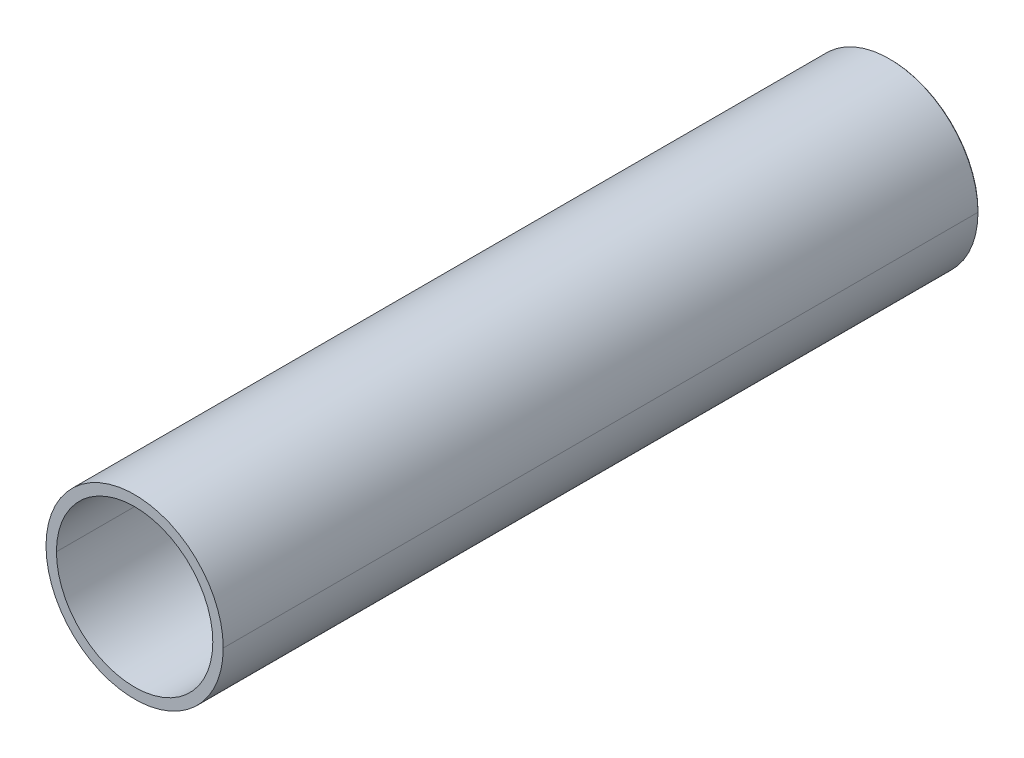
ISO-10303-21;
HEADER;
FILE_DESCRIPTION(('STEP AP214'),'2;1');
FILE_NAME('part.step','',(''),(''),'','','');
FILE_SCHEMA(('AUTOMOTIVE_DESIGN { 1 0 10303 214 1 1 1 1 }'));
ENDSEC;
DATA;
#1=APPLICATION_CONTEXT('core data for automotive mechanical design processes');
#2=APPLICATION_PROTOCOL_DEFINITION('international standard','automotive_design',2000,#1);
#3=PRODUCT_CONTEXT('',#1,'mechanical');
#4=PRODUCT('Part','Part','',(#3));
#5=PRODUCT_RELATED_PRODUCT_CATEGORY('part','',(#4));
#6=PRODUCT_DEFINITION_FORMATION('','',#4);
#7=PRODUCT_DEFINITION_CONTEXT('part definition',#1,'design');
#8=PRODUCT_DEFINITION('design','',#6,#7);
#9=PRODUCT_DEFINITION_SHAPE('','',#8);
#10=(LENGTH_UNIT() NAMED_UNIT(*) SI_UNIT(.MILLI.,.METRE.));
#11=(NAMED_UNIT(*) PLANE_ANGLE_UNIT() SI_UNIT($,.RADIAN.));
#12=(NAMED_UNIT(*) SI_UNIT($,.STERADIAN.) SOLID_ANGLE_UNIT());
#13=UNCERTAINTY_MEASURE_WITH_UNIT(LENGTH_MEASURE(1.E-05),#10,'distance_accuracy_value','');
#14=(GEOMETRIC_REPRESENTATION_CONTEXT(3) GLOBAL_UNCERTAINTY_ASSIGNED_CONTEXT((#13)) GLOBAL_UNIT_ASSIGNED_CONTEXT((#10,
#11,#12)) REPRESENTATION_CONTEXT('',''));
#15=CARTESIAN_POINT('',(0.,0.,0.));
#16=DIRECTION('',(0.,0.,1.));
#17=DIRECTION('',(1.,0.,0.));
#18=AXIS2_PLACEMENT_3D('',#15,#16,#17);
#19=CARTESIAN_POINT('',(0.,0.,-287.));
#20=DIRECTION('',(0.,0.,1.));
#21=DIRECTION('',(1.,0.,0.));
#22=AXIS2_PLACEMENT_3D('',#19,#20,#21);
#23=CYLINDRICAL_SURFACE('',#22,15.);
#24=CARTESIAN_POINT('',(0.,0.,-240.));
#25=DIRECTION('',(0.,0.,1.));
#26=DIRECTION('',(1.,0.,0.));
#27=AXIS2_PLACEMENT_3D('',#24,#25,#26);
#28=CIRCLE('',#27,15.);
#29=CARTESIAN_POINT('',(-15.,0.,-240.));
#30=VERTEX_POINT('',#29);
#31=CARTESIAN_POINT('',(15.,0.,-240.));
#32=VERTEX_POINT('',#31);
#33=EDGE_CURVE('E66',#30,#32,#28,.F.);
#34=ORIENTED_EDGE('',*,*,#33,.F.);
#35=DIRECTION('',(0.,0.,1.));
#36=VECTOR('',#35,1.);
#37=CARTESIAN_POINT('',(-15.,0.,-287.));
#38=LINE('',#37,#36);
#39=CARTESIAN_POINT('',(-15.,0.,-287.));
#40=VERTEX_POINT('',#39);
#41=EDGE_CURVE('E191',#40,#30,#38,.T.);
#42=ORIENTED_EDGE('',*,*,#41,.F.);
#43=CARTESIAN_POINT('',(0.,0.,-287.));
#44=DIRECTION('',(0.,0.,1.));
#45=DIRECTION('',(1.,0.,0.));
#46=AXIS2_PLACEMENT_3D('',#43,#44,#45);
#47=CIRCLE('',#46,15.);
#48=CARTESIAN_POINT('',(15.,0.,-287.));
#49=VERTEX_POINT('',#48);
#50=EDGE_CURVE('E184',#49,#40,#47,.T.);
#51=ORIENTED_EDGE('',*,*,#50,.F.);
#52=DIRECTION('',(0.,0.,1.));
#53=VECTOR('',#52,1.);
#54=CARTESIAN_POINT('',(15.,0.,-287.));
#55=LINE('',#54,#53);
#56=EDGE_CURVE('E172',#49,#32,#55,.T.);
#57=ORIENTED_EDGE('',*,*,#56,.T.);
#58=EDGE_LOOP('',(#34,#42,#51,#57));
#59=FACE_BOUND('',#58,.T.);
#60=ADVANCED_FACE('F51',(#59),#23,.F.);
#61=CARTESIAN_POINT('',(0.,0.,-385.));
#62=DIRECTION('',(0.,0.,1.));
#63=DIRECTION('',(1.,0.,0.));
#64=AXIS2_PLACEMENT_3D('',#61,#62,#63);
#65=CYLINDRICAL_SURFACE('',#64,17.);
#66=DIRECTION('',(0.,0.,1.));
#67=VECTOR('',#66,1.);
#68=CARTESIAN_POINT('',(17.,0.,-385.));
#69=LINE('',#68,#67);
#70=CARTESIAN_POINT('',(17.,0.,-384.8));
#71=VERTEX_POINT('',#70);
#72=CARTESIAN_POINT('',(17.,0.,-240.));
#73=VERTEX_POINT('',#72);
#74=EDGE_CURVE('E135',#71,#73,#69,.T.);
#75=ORIENTED_EDGE('',*,*,#74,.T.);
#76=CARTESIAN_POINT('',(0.,0.,-240.));
#77=DIRECTION('',(0.,0.,1.));
#78=DIRECTION('',(1.,0.,0.));
#79=AXIS2_PLACEMENT_3D('',#76,#77,#78);
#80=CIRCLE('',#79,17.);
#81=CARTESIAN_POINT('',(-17.,0.,-240.));
#82=VERTEX_POINT('',#81);
#83=EDGE_CURVE('E73',#73,#82,#80,.F.);
#84=ORIENTED_EDGE('',*,*,#83,.T.);
#85=DIRECTION('',(0.,0.,1.));
#86=VECTOR('',#85,1.);
#87=CARTESIAN_POINT('',(-17.,0.,-385.));
#88=LINE('',#87,#86);
#89=CARTESIAN_POINT('',(-17.,0.,-384.8));
#90=VERTEX_POINT('',#89);
#91=EDGE_CURVE('E133',#90,#82,#88,.T.);
#92=ORIENTED_EDGE('',*,*,#91,.F.);
#93=CARTESIAN_POINT('',(0.,0.,-384.8));
#94=DIRECTION('',(0.,0.,1.));
#95=DIRECTION('',(1.,0.,0.));
#96=AXIS2_PLACEMENT_3D('',#93,#94,#95);
#97=CIRCLE('',#96,17.);
#98=EDGE_CURVE('E164',#90,#71,#97,.T.);
#99=ORIENTED_EDGE('',*,*,#98,.T.);
#100=EDGE_LOOP('',(#75,#84,#92,#99));
#101=FACE_BOUND('',#100,.T.);
#102=ADVANCED_FACE('F132',(#101),#65,.T.);
#103=CARTESIAN_POINT('',(0.,0.,-287.));
#104=DIRECTION('',(0.,0.,1.));
#105=DIRECTION('',(1.,0.,0.));
#106=AXIS2_PLACEMENT_3D('',#103,#104,#105);
#107=CYLINDRICAL_SURFACE('',#106,15.);
#108=CARTESIAN_POINT('',(0.,0.,-240.));
#109=DIRECTION('',(0.,0.,1.));
#110=DIRECTION('',(1.,0.,0.));
#111=AXIS2_PLACEMENT_3D('',#108,#109,#110);
#112=CIRCLE('',#111,15.);
#113=EDGE_CURVE('E137',#32,#30,#112,.F.);
#114=ORIENTED_EDGE('',*,*,#113,.F.);
#115=ORIENTED_EDGE('',*,*,#56,.F.);
#116=CARTESIAN_POINT('',(0.,0.,-287.));
#117=DIRECTION('',(0.,0.,1.));
#118=DIRECTION('',(1.,0.,0.));
#119=AXIS2_PLACEMENT_3D('',#116,#117,#118);
#120=CIRCLE('',#119,15.);
#121=EDGE_CURVE('E202',#40,#49,#120,.T.);
#122=ORIENTED_EDGE('',*,*,#121,.F.);
#123=ORIENTED_EDGE('',*,*,#41,.T.);
#124=EDGE_LOOP('',(#114,#115,#122,#123));
#125=FACE_BOUND('',#124,.T.);
#126=ADVANCED_FACE('F226',(#125),#107,.F.);
#127=CARTESIAN_POINT('',(0.,0.,-385.));
#128=DIRECTION('',(0.,0.,1.));
#129=DIRECTION('',(1.,0.,0.));
#130=AXIS2_PLACEMENT_3D('',#127,#128,#129);
#131=CYLINDRICAL_SURFACE('',#130,17.);
#132=ORIENTED_EDGE('',*,*,#91,.T.);
#133=CARTESIAN_POINT('',(0.,0.,-240.));
#134=DIRECTION('',(0.,0.,1.));
#135=DIRECTION('',(1.,0.,0.));
#136=AXIS2_PLACEMENT_3D('',#133,#134,#135);
#137=CIRCLE('',#136,17.);
#138=EDGE_CURVE('E11',#82,#73,#137,.F.);
#139=ORIENTED_EDGE('',*,*,#138,.T.);
#140=ORIENTED_EDGE('',*,*,#74,.F.);
#141=CARTESIAN_POINT('',(0.,0.,-384.8));
#142=DIRECTION('',(0.,0.,1.));
#143=DIRECTION('',(1.,0.,0.));
#144=AXIS2_PLACEMENT_3D('',#141,#142,#143);
#145=CIRCLE('',#144,17.);
#146=EDGE_CURVE('E141',#71,#90,#145,.T.);
#147=ORIENTED_EDGE('',*,*,#146,.T.);
#148=EDGE_LOOP('',(#132,#139,#140,#147));
#149=FACE_BOUND('',#148,.T.);
#150=ADVANCED_FACE('F139',(#149),#131,.T.);
#151=CARTESIAN_POINT('',(0.,0.,-287.));
#152=DIRECTION('',(0.,0.,-1.));
#153=DIRECTION('',(-1.,0.,0.));
#154=AXIS2_PLACEMENT_3D('',#151,#152,#153);
#155=CYLINDRICAL_SURFACE('',#154,15.1);
#156=DIRECTION('',(0.,0.,-1.));
#157=VECTOR('',#156,1.);
#158=CARTESIAN_POINT('',(15.1,0.,-287.));
#159=LINE('',#158,#157);
#160=CARTESIAN_POINT('',(15.1,0.,-287.));
#161=VERTEX_POINT('',#160);
#162=CARTESIAN_POINT('',(15.1,0.,-384.8));
#163=VERTEX_POINT('',#162);
#164=EDGE_CURVE('E176',#161,#163,#159,.T.);
#165=ORIENTED_EDGE('',*,*,#164,.F.);
#166=CARTESIAN_POINT('',(0.,0.,-287.));
#167=DIRECTION('',(0.,0.,-1.));
#168=DIRECTION('',(-1.,0.,0.));
#169=AXIS2_PLACEMENT_3D('',#166,#167,#168);
#170=CIRCLE('',#169,15.1);
#171=CARTESIAN_POINT('',(-15.1,0.,-287.));
#172=VERTEX_POINT('',#171);
#173=EDGE_CURVE('E179',#172,#161,#170,.T.);
#174=ORIENTED_EDGE('',*,*,#173,.F.);
#175=DIRECTION('',(0.,0.,-1.));
#176=VECTOR('',#175,1.);
#177=CARTESIAN_POINT('',(-15.1,0.,-287.));
#178=LINE('',#177,#176);
#179=CARTESIAN_POINT('',(-15.1,0.,-384.8));
#180=VERTEX_POINT('',#179);
#181=EDGE_CURVE('E168',#172,#180,#178,.T.);
#182=ORIENTED_EDGE('',*,*,#181,.T.);
#183=CARTESIAN_POINT('',(0.,0.,-384.8));
#184=DIRECTION('',(0.,0.,-1.));
#185=DIRECTION('',(-1.,0.,0.));
#186=AXIS2_PLACEMENT_3D('',#183,#184,#185);
#187=CIRCLE('',#186,15.1);
#188=EDGE_CURVE('E60',#180,#163,#187,.T.);
#189=ORIENTED_EDGE('',*,*,#188,.T.);
#190=EDGE_LOOP('',(#165,#174,#182,#189));
#191=FACE_BOUND('',#190,.T.);
#192=ADVANCED_FACE('F238',(#191),#155,.F.);
#193=CARTESIAN_POINT('',(0.,0.,-385.));
#194=DIRECTION('',(0.,0.,-1.));
#195=DIRECTION('',(-1.,0.,0.));
#196=AXIS2_PLACEMENT_3D('',#193,#194,#195);
#197=CONICAL_SURFACE('',#196,15.3,0.785398163397457);
#198=DIRECTION('',(0.707106781186554,0.,-0.707106781186542));
#199=VECTOR('',#198,1.);
#200=CARTESIAN_POINT('',(15.3,0.,-385.));
#201=LINE('',#200,#199);
#202=CARTESIAN_POINT('',(15.3,0.,-385.));
#203=VERTEX_POINT('',#202);
#204=EDGE_CURVE('E159',#163,#203,#201,.T.);
#205=ORIENTED_EDGE('',*,*,#204,.F.);
#206=ORIENTED_EDGE('',*,*,#188,.F.);
#207=DIRECTION('',(-0.707106781186554,0.,-0.707106781186542));
#208=VECTOR('',#207,1.);
#209=CARTESIAN_POINT('',(-15.3,0.,-385.));
#210=LINE('',#209,#208);
#211=CARTESIAN_POINT('',(-15.3,0.,-385.));
#212=VERTEX_POINT('',#211);
#213=EDGE_CURVE('E150',#180,#212,#210,.T.);
#214=ORIENTED_EDGE('',*,*,#213,.T.);
#215=CARTESIAN_POINT('',(0.,0.,-385.));
#216=DIRECTION('',(0.,0.,-1.));
#217=DIRECTION('',(-1.,0.,0.));
#218=AXIS2_PLACEMENT_3D('',#215,#216,#217);
#219=CIRCLE('',#218,15.3);
#220=EDGE_CURVE('E187',#212,#203,#219,.T.);
#221=ORIENTED_EDGE('',*,*,#220,.T.);
#222=EDGE_LOOP('',(#205,#206,#214,#221));
#223=FACE_BOUND('',#222,.T.);
#224=ADVANCED_FACE('F232',(#223),#197,.F.);
#225=CARTESIAN_POINT('',(0.,0.,-287.));
#226=DIRECTION('',(0.,0.,-1.));
#227=DIRECTION('',(0.,-1.,0.));
#228=AXIS2_PLACEMENT_3D('',#225,#226,#227);
#229=PLANE('',#228);
#230=ORIENTED_EDGE('',*,*,#50,.T.);
#231=ORIENTED_EDGE('',*,*,#121,.T.);
#232=EDGE_LOOP('',(#230,#231));
#233=FACE_BOUND('',#232,.T.);
#234=ORIENTED_EDGE('',*,*,#173,.T.);
#235=CARTESIAN_POINT('',(0.,0.,-287.));
#236=DIRECTION('',(0.,0.,-1.));
#237=DIRECTION('',(-1.,0.,0.));
#238=AXIS2_PLACEMENT_3D('',#235,#236,#237);
#239=CIRCLE('',#238,15.1);
#240=EDGE_CURVE('E154',#161,#172,#239,.T.);
#241=ORIENTED_EDGE('',*,*,#240,.T.);
#242=EDGE_LOOP('',(#234,#241));
#243=FACE_BOUND('',#242,.T.);
#244=ADVANCED_FACE('F228',(#233,#243),#229,.T.);
#245=CARTESIAN_POINT('',(0.,0.,-385.));
#246=DIRECTION('',(0.,0.,1.));
#247=DIRECTION('',(1.,0.,0.));
#248=AXIS2_PLACEMENT_3D('',#245,#246,#247);
#249=PLANE('',#248);
#250=ORIENTED_EDGE('',*,*,#220,.F.);
#251=CARTESIAN_POINT('',(0.,0.,-385.));
#252=DIRECTION('',(0.,0.,-1.));
#253=DIRECTION('',(-1.,0.,0.));
#254=AXIS2_PLACEMENT_3D('',#251,#252,#253);
#255=CIRCLE('',#254,15.3);
#256=EDGE_CURVE('E155',#203,#212,#255,.T.);
#257=ORIENTED_EDGE('',*,*,#256,.F.);
#258=EDGE_LOOP('',(#250,#257));
#259=FACE_BOUND('',#258,.T.);
#260=CARTESIAN_POINT('',(0.,0.,-385.));
#261=DIRECTION('',(0.,0.,1.));
#262=DIRECTION('',(1.,0.,0.));
#263=AXIS2_PLACEMENT_3D('',#260,#261,#262);
#264=CIRCLE('',#263,16.8);
#265=CARTESIAN_POINT('',(16.8,0.,-385.));
#266=VERTEX_POINT('',#265);
#267=CARTESIAN_POINT('',(-16.8,0.,-385.));
#268=VERTEX_POINT('',#267);
#269=EDGE_CURVE('E146',#266,#268,#264,.T.);
#270=ORIENTED_EDGE('',*,*,#269,.F.);
#271=CARTESIAN_POINT('',(0.,0.,-385.));
#272=DIRECTION('',(0.,0.,1.));
#273=DIRECTION('',(1.,0.,0.));
#274=AXIS2_PLACEMENT_3D('',#271,#272,#273);
#275=CIRCLE('',#274,16.8);
#276=EDGE_CURVE('E167',#268,#266,#275,.T.);
#277=ORIENTED_EDGE('',*,*,#276,.F.);
#278=EDGE_LOOP('',(#270,#277));
#279=FACE_BOUND('',#278,.T.);
#280=ADVANCED_FACE('F231',(#259,#279),#249,.F.);
#281=CARTESIAN_POINT('',(0.,0.,-384.8));
#282=DIRECTION('',(0.,0.,1.));
#283=DIRECTION('',(1.,0.,0.));
#284=AXIS2_PLACEMENT_3D('',#281,#282,#283);
#285=CONICAL_SURFACE('',#284,17.,0.785398163397414);
#286=DIRECTION('',(-0.707106781186523,0.,0.707106781186572));
#287=VECTOR('',#286,1.);
#288=CARTESIAN_POINT('',(-17.,0.,-384.8));
#289=LINE('',#288,#287);
#290=EDGE_CURVE('E183',#268,#90,#289,.T.);
#291=ORIENTED_EDGE('',*,*,#290,.F.);
#292=ORIENTED_EDGE('',*,*,#276,.T.);
#293=DIRECTION('',(0.707106781186523,0.,0.707106781186572));
#294=VECTOR('',#293,1.);
#295=CARTESIAN_POINT('',(17.,0.,-384.8));
#296=LINE('',#295,#294);
#297=EDGE_CURVE('E195',#266,#71,#296,.T.);
#298=ORIENTED_EDGE('',*,*,#297,.T.);
#299=ORIENTED_EDGE('',*,*,#98,.F.);
#300=EDGE_LOOP('',(#291,#292,#298,#299));
#301=FACE_BOUND('',#300,.T.);
#302=ADVANCED_FACE('F250',(#301),#285,.T.);
#303=CARTESIAN_POINT('',(0.,0.,-287.));
#304=DIRECTION('',(0.,0.,-1.));
#305=DIRECTION('',(-1.,0.,0.));
#306=AXIS2_PLACEMENT_3D('',#303,#304,#305);
#307=CYLINDRICAL_SURFACE('',#306,15.1);
#308=ORIENTED_EDGE('',*,*,#240,.F.);
#309=ORIENTED_EDGE('',*,*,#164,.T.);
#310=CARTESIAN_POINT('',(0.,0.,-384.8));
#311=DIRECTION('',(0.,0.,-1.));
#312=DIRECTION('',(-1.,0.,0.));
#313=AXIS2_PLACEMENT_3D('',#310,#311,#312);
#314=CIRCLE('',#313,15.1);
#315=EDGE_CURVE('E162',#163,#180,#314,.T.);
#316=ORIENTED_EDGE('',*,*,#315,.T.);
#317=ORIENTED_EDGE('',*,*,#181,.F.);
#318=EDGE_LOOP('',(#308,#309,#316,#317));
#319=FACE_BOUND('',#318,.T.);
#320=ADVANCED_FACE('F241',(#319),#307,.F.);
#321=CARTESIAN_POINT('',(0.,0.,-385.));
#322=DIRECTION('',(0.,0.,-1.));
#323=DIRECTION('',(-1.,0.,0.));
#324=AXIS2_PLACEMENT_3D('',#321,#322,#323);
#325=CONICAL_SURFACE('',#324,15.3,0.785398163397457);
#326=ORIENTED_EDGE('',*,*,#315,.F.);
#327=ORIENTED_EDGE('',*,*,#204,.T.);
#328=ORIENTED_EDGE('',*,*,#256,.T.);
#329=ORIENTED_EDGE('',*,*,#213,.F.);
#330=EDGE_LOOP('',(#326,#327,#328,#329));
#331=FACE_BOUND('',#330,.T.);
#332=ADVANCED_FACE('F53',(#331),#325,.F.);
#333=CARTESIAN_POINT('',(0.,0.,-384.8));
#334=DIRECTION('',(0.,0.,1.));
#335=DIRECTION('',(1.,0.,0.));
#336=AXIS2_PLACEMENT_3D('',#333,#334,#335);
#337=CONICAL_SURFACE('',#336,17.,0.785398163397414);
#338=ORIENTED_EDGE('',*,*,#269,.T.);
#339=ORIENTED_EDGE('',*,*,#290,.T.);
#340=ORIENTED_EDGE('',*,*,#146,.F.);
#341=ORIENTED_EDGE('',*,*,#297,.F.);
#342=EDGE_LOOP('',(#338,#339,#340,#341));
#343=FACE_BOUND('',#342,.T.);
#344=ADVANCED_FACE('F256',(#343),#337,.T.);
#345=CARTESIAN_POINT('',(0.,0.,-240.));
#346=DIRECTION('',(0.,0.,1.));
#347=DIRECTION('',(1.,0.,0.));
#348=AXIS2_PLACEMENT_3D('',#345,#346,#347);
#349=PLANE('',#348);
#350=ORIENTED_EDGE('',*,*,#138,.F.);
#351=ORIENTED_EDGE('',*,*,#83,.F.);
#352=EDGE_LOOP('',(#350,#351));
#353=FACE_BOUND('',#352,.T.);
#354=ORIENTED_EDGE('',*,*,#33,.T.);
#355=ORIENTED_EDGE('',*,*,#113,.T.);
#356=EDGE_LOOP('',(#354,#355));
#357=FACE_BOUND('',#356,.T.);
#358=ADVANCED_FACE('F125',(#353,#357),#349,.T.);
#359=CLOSED_SHELL('',(#60,#102,#126,#150,#192,#224,#244,#280,#302,#320,#332,#344,#358));
#360=MANIFOLD_SOLID_BREP('B2',#359);
#361=ADVANCED_BREP_SHAPE_REPRESENTATION('',(#18,#360),#14);
#362=SHAPE_DEFINITION_REPRESENTATION(#9,#361);
ENDSEC;
END-ISO-10303-21;
